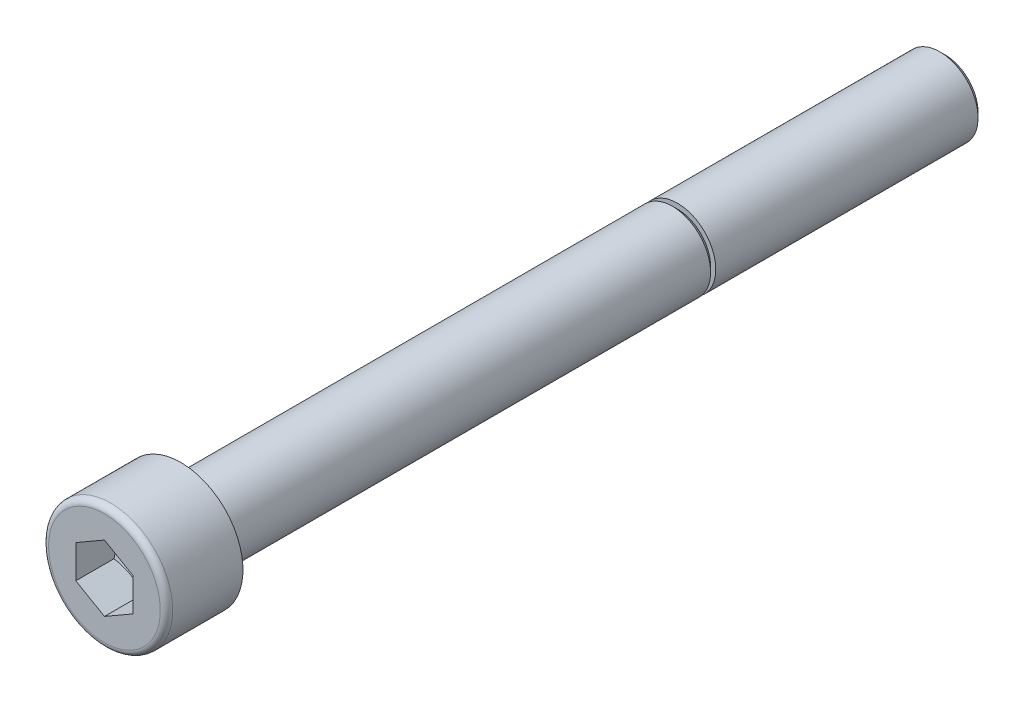
ISO-10303-21;
HEADER;
FILE_DESCRIPTION(('STEP AP214'),'2;1');
FILE_NAME('part.step','',(''),(''),'','','');
FILE_SCHEMA(('AUTOMOTIVE_DESIGN { 1 0 10303 214 1 1 1 1 }'));
ENDSEC;
DATA;
#1=APPLICATION_CONTEXT('core data for automotive mechanical design processes');
#2=APPLICATION_PROTOCOL_DEFINITION('international standard','automotive_design',2000,#1);
#3=PRODUCT_CONTEXT('',#1,'mechanical');
#4=PRODUCT('Part','Part','',(#3));
#5=PRODUCT_RELATED_PRODUCT_CATEGORY('part','',(#4));
#6=PRODUCT_DEFINITION_FORMATION('','',#4);
#7=PRODUCT_DEFINITION_CONTEXT('part definition',#1,'design');
#8=PRODUCT_DEFINITION('design','',#6,#7);
#9=PRODUCT_DEFINITION_SHAPE('','',#8);
#10=(LENGTH_UNIT() NAMED_UNIT(*) SI_UNIT(.MILLI.,.METRE.));
#11=(NAMED_UNIT(*) PLANE_ANGLE_UNIT() SI_UNIT($,.RADIAN.));
#12=(NAMED_UNIT(*) SI_UNIT($,.STERADIAN.) SOLID_ANGLE_UNIT());
#13=UNCERTAINTY_MEASURE_WITH_UNIT(LENGTH_MEASURE(1.E-05),#10,'distance_accuracy_value','');
#14=(GEOMETRIC_REPRESENTATION_CONTEXT(3) GLOBAL_UNCERTAINTY_ASSIGNED_CONTEXT((#13)) GLOBAL_UNIT_ASSIGNED_CONTEXT((#10,
#11,#12)) REPRESENTATION_CONTEXT('',''));
#15=CARTESIAN_POINT('',(0.,0.,0.));
#16=DIRECTION('',(0.,0.,1.));
#17=DIRECTION('',(1.,0.,0.));
#18=AXIS2_PLACEMENT_3D('',#15,#16,#17);
#19=CARTESIAN_POINT('',(-3.25,0.,0.));
#20=DIRECTION('',(0.,0.,-1.));
#21=DIRECTION('',(-1.,0.,0.));
#22=AXIS2_PLACEMENT_3D('',#19,#20,#21);
#23=PLANE('',#22);
#24=CARTESIAN_POINT('',(0.,0.,0.));
#25=DIRECTION('',(0.,0.,-1.));
#26=DIRECTION('',(-1.,0.,0.));
#27=AXIS2_PLACEMENT_3D('',#24,#25,#26);
#28=CIRCLE('',#27,6.5);
#29=CARTESIAN_POINT('',(-6.5,0.,0.));
#30=VERTEX_POINT('',#29);
#31=EDGE_CURVE('E12',#30,#30,#28,.T.);
#32=ORIENTED_EDGE('',*,*,#31,.T.);
#33=EDGE_LOOP('',(#32));
#34=FACE_BOUND('',#33,.T.);
#35=CARTESIAN_POINT('',(0.,0.,0.));
#36=DIRECTION('',(0.,0.,1.));
#37=DIRECTION('',(-1.,0.,0.));
#38=AXIS2_PLACEMENT_3D('',#35,#36,#37);
#39=CIRCLE('',#38,4.);
#40=CARTESIAN_POINT('',(4.,0.,0.));
#41=VERTEX_POINT('',#40);
#42=EDGE_CURVE('E152',#41,#41,#39,.T.);
#43=ORIENTED_EDGE('',*,*,#42,.T.);
#44=EDGE_LOOP('',(#43));
#45=FACE_BOUND('',#44,.T.);
#46=ADVANCED_FACE('F20',(#34,#45),#23,.T.);
#47=CARTESIAN_POINT('',(0.,0.,3.675));
#48=DIRECTION('',(0.,0.,1.));
#49=DIRECTION('',(-1.,0.,0.));
#50=AXIS2_PLACEMENT_3D('',#47,#48,#49);
#51=CYLINDRICAL_SURFACE('',#50,6.5);
#52=CARTESIAN_POINT('',(0.,0.,7.35));
#53=DIRECTION('',(0.,0.,-1.));
#54=DIRECTION('',(-1.,0.,0.));
#55=AXIS2_PLACEMENT_3D('',#52,#53,#54);
#56=CIRCLE('',#55,6.5);
#57=CARTESIAN_POINT('',(-6.5,0.,7.35));
#58=VERTEX_POINT('',#57);
#59=EDGE_CURVE('E24',#58,#58,#56,.T.);
#60=ORIENTED_EDGE('',*,*,#59,.T.);
#61=EDGE_LOOP('',(#60));
#62=FACE_BOUND('',#61,.T.);
#63=ORIENTED_EDGE('',*,*,#31,.F.);
#64=EDGE_LOOP('',(#63));
#65=FACE_BOUND('',#64,.T.);
#66=ADVANCED_FACE('F285',(#62,#65),#51,.T.);
#67=CARTESIAN_POINT('',(0.,0.,7.35));
#68=DIRECTION('',(0.,0.,-1.));
#69=DIRECTION('',(0.,-1.,0.));
#70=AXIS2_PLACEMENT_3D('',#67,#68,#69);
#71=TOROIDAL_SURFACE('',#70,5.85,0.65);
#72=CARTESIAN_POINT('',(0.,0.,8.));
#73=DIRECTION('',(0.,0.,-1.));
#74=DIRECTION('',(-1.,0.,0.));
#75=AXIS2_PLACEMENT_3D('',#72,#73,#74);
#76=CIRCLE('',#75,5.85);
#77=CARTESIAN_POINT('',(-5.85,0.,8.));
#78=VERTEX_POINT('',#77);
#79=EDGE_CURVE('E210',#78,#78,#76,.T.);
#80=ORIENTED_EDGE('',*,*,#79,.T.);
#81=EDGE_LOOP('',(#80));
#82=FACE_BOUND('',#81,.T.);
#83=ORIENTED_EDGE('',*,*,#59,.F.);
#84=EDGE_LOOP('',(#83));
#85=FACE_BOUND('',#84,.T.);
#86=ADVANCED_FACE('F22',(#82,#85),#71,.T.);
#87=CARTESIAN_POINT('',(-2.925,0.,8.));
#88=DIRECTION('',(0.,0.,1.));
#89=DIRECTION('',(1.,0.,0.));
#90=AXIS2_PLACEMENT_3D('',#87,#88,#89);
#91=PLANE('',#90);
#92=ORIENTED_EDGE('',*,*,#79,.F.);
#93=EDGE_LOOP('',(#92));
#94=FACE_BOUND('',#93,.T.);
#95=DIRECTION('',(-0.866025403784439,-0.5,0.));
#96=VECTOR('',#95,1.);
#97=CARTESIAN_POINT('',(0.403124300624837,-3.23135607651737,8.));
#98=LINE('',#97,#96);
#99=CARTESIAN_POINT('',(2.99999860124967,-1.73205,8.));
#100=VERTEX_POINT('',#99);
#101=CARTESIAN_POINT('',(0.,-3.4641,8.));
#102=VERTEX_POINT('',#101);
#103=EDGE_CURVE('E99',#100,#102,#98,.T.);
#104=ORIENTED_EDGE('',*,*,#103,.T.);
#105=DIRECTION('',(-0.866025403784439,0.5,0.));
#106=VECTOR('',#105,1.);
#107=CARTESIAN_POINT('',(-2.59687430062483,-1.96479392348263,8.));
#108=LINE('',#107,#106);
#109=CARTESIAN_POINT('',(-2.99999860124967,-1.73205,8.));
#110=VERTEX_POINT('',#109);
#111=EDGE_CURVE('E165',#102,#110,#108,.T.);
#112=ORIENTED_EDGE('',*,*,#111,.T.);
#113=DIRECTION('',(0.,1.,0.));
#114=VECTOR('',#113,1.);
#115=CARTESIAN_POINT('',(-2.99999860124967,0.,8.));
#116=LINE('',#115,#114);
#117=CARTESIAN_POINT('',(-2.99999860124967,1.73205,8.));
#118=VERTEX_POINT('',#117);
#119=EDGE_CURVE('E166',#110,#118,#116,.T.);
#120=ORIENTED_EDGE('',*,*,#119,.T.);
#121=DIRECTION('',(0.866025403784439,0.5,0.));
#122=VECTOR('',#121,1.);
#123=CARTESIAN_POINT('',(-2.59687430062483,1.96479392348263,8.));
#124=LINE('',#123,#122);
#125=CARTESIAN_POINT('',(0.,3.4641,8.));
#126=VERTEX_POINT('',#125);
#127=EDGE_CURVE('E155',#118,#126,#124,.T.);
#128=ORIENTED_EDGE('',*,*,#127,.T.);
#129=DIRECTION('',(0.866025403784439,-0.5,0.));
#130=VECTOR('',#129,1.);
#131=CARTESIAN_POINT('',(0.403124300624837,3.23135607651737,8.));
#132=LINE('',#131,#130);
#133=CARTESIAN_POINT('',(2.99999860124967,1.73205,8.));
#134=VERTEX_POINT('',#133);
#135=EDGE_CURVE('E196',#126,#134,#132,.T.);
#136=ORIENTED_EDGE('',*,*,#135,.T.);
#137=DIRECTION('',(0.,-1.,0.));
#138=VECTOR('',#137,1.);
#139=CARTESIAN_POINT('',(2.99999860124967,0.,8.));
#140=LINE('',#139,#138);
#141=EDGE_CURVE('E103',#134,#100,#140,.T.);
#142=ORIENTED_EDGE('',*,*,#141,.T.);
#143=EDGE_LOOP('',(#104,#112,#120,#128,#136,#142));
#144=FACE_BOUND('',#143,.T.);
#145=ADVANCED_FACE('F258',(#94,#144),#91,.T.);
#146=CARTESIAN_POINT('',(-1.729375,0.,-80.));
#147=DIRECTION('',(0.,0.,-1.));
#148=DIRECTION('',(-1.,0.,0.));
#149=AXIS2_PLACEMENT_3D('',#146,#147,#148);
#150=PLANE('',#149);
#151=CARTESIAN_POINT('',(0.,0.,-80.));
#152=DIRECTION('',(0.,0.,-1.));
#153=DIRECTION('',(-1.,0.,0.));
#154=AXIS2_PLACEMENT_3D('',#151,#152,#153);
#155=CIRCLE('',#154,3.45875);
#156=CARTESIAN_POINT('',(-3.45875,0.,-80.));
#157=VERTEX_POINT('',#156);
#158=EDGE_CURVE('E150',#157,#157,#155,.T.);
#159=ORIENTED_EDGE('',*,*,#158,.T.);
#160=EDGE_LOOP('',(#159));
#161=FACE_BOUND('',#160,.T.);
#162=ADVANCED_FACE('F280',(#161),#150,.T.);
#163=CARTESIAN_POINT('',(0.,0.,-79.729375));
#164=DIRECTION('',(0.,0.,1.));
#165=DIRECTION('',(-1.,0.,0.));
#166=AXIS2_PLACEMENT_3D('',#163,#164,#165);
#167=CONICAL_SURFACE('',#166,3.729375,0.785398163397443);
#168=CARTESIAN_POINT('',(0.,0.,-79.45875));
#169=DIRECTION('',(0.,0.,-1.));
#170=DIRECTION('',(-1.,0.,0.));
#171=AXIS2_PLACEMENT_3D('',#168,#169,#170);
#172=CIRCLE('',#171,4.);
#173=CARTESIAN_POINT('',(-4.,0.,-79.45875));
#174=VERTEX_POINT('',#173);
#175=EDGE_CURVE('E144',#174,#174,#172,.T.);
#176=ORIENTED_EDGE('',*,*,#175,.T.);
#177=EDGE_LOOP('',(#176));
#178=FACE_BOUND('',#177,.T.);
#179=ORIENTED_EDGE('',*,*,#158,.F.);
#180=EDGE_LOOP('',(#179));
#181=FACE_BOUND('',#180,.T.);
#182=ADVANCED_FACE('F266',(#178,#181),#167,.T.);
#183=CARTESIAN_POINT('',(0.,0.,-65.729375));
#184=DIRECTION('',(0.,0.,1.));
#185=DIRECTION('',(-1.,0.,0.));
#186=AXIS2_PLACEMENT_3D('',#183,#184,#185);
#187=CYLINDRICAL_SURFACE('',#186,4.);
#188=CARTESIAN_POINT('',(0.,0.,-52.));
#189=DIRECTION('',(0.,0.,-1.));
#190=DIRECTION('',(-1.,0.,0.));
#191=AXIS2_PLACEMENT_3D('',#188,#189,#190);
#192=CIRCLE('',#191,4.);
#193=CARTESIAN_POINT('',(-4.,0.,-52.));
#194=VERTEX_POINT('',#193);
#195=EDGE_CURVE('E151',#194,#194,#192,.T.);
#196=ORIENTED_EDGE('',*,*,#195,.T.);
#197=EDGE_LOOP('',(#196));
#198=FACE_BOUND('',#197,.T.);
#199=ORIENTED_EDGE('',*,*,#175,.F.);
#200=EDGE_LOOP('',(#199));
#201=FACE_BOUND('',#200,.T.);
#202=ADVANCED_FACE('F269',(#198,#201),#187,.T.);
#203=CARTESIAN_POINT('',(-3.729375,0.,-52.));
#204=DIRECTION('',(0.,0.,1.));
#205=DIRECTION('',(1.,0.,0.));
#206=AXIS2_PLACEMENT_3D('',#203,#204,#205);
#207=PLANE('',#206);
#208=CARTESIAN_POINT('',(0.,0.,-52.));
#209=DIRECTION('',(0.,0.,-1.));
#210=DIRECTION('',(-1.,0.,0.));
#211=AXIS2_PLACEMENT_3D('',#208,#209,#210);
#212=CIRCLE('',#211,3.45875);
#213=CARTESIAN_POINT('',(-3.45875,0.,-52.));
#214=VERTEX_POINT('',#213);
#215=EDGE_CURVE('E200',#214,#214,#212,.T.);
#216=ORIENTED_EDGE('',*,*,#215,.T.);
#217=EDGE_LOOP('',(#216));
#218=FACE_BOUND('',#217,.T.);
#219=ORIENTED_EDGE('',*,*,#195,.F.);
#220=EDGE_LOOP('',(#219));
#221=FACE_BOUND('',#220,.T.);
#222=ADVANCED_FACE('F271',(#218,#221),#207,.T.);
#223=CARTESIAN_POINT('',(0.,0.,-51.729375));
#224=DIRECTION('',(0.,0.,1.));
#225=DIRECTION('',(-1.,0.,0.));
#226=AXIS2_PLACEMENT_3D('',#223,#224,#225);
#227=CONICAL_SURFACE('',#226,3.729375,0.78539816339745);
#228=CARTESIAN_POINT('',(0.,0.,-51.45875));
#229=DIRECTION('',(0.,0.,-1.));
#230=DIRECTION('',(-1.,0.,0.));
#231=AXIS2_PLACEMENT_3D('',#228,#229,#230);
#232=CIRCLE('',#231,4.);
#233=CARTESIAN_POINT('',(-4.,0.,-51.45875));
#234=VERTEX_POINT('',#233);
#235=EDGE_CURVE('E131',#234,#234,#232,.T.);
#236=ORIENTED_EDGE('',*,*,#235,.T.);
#237=EDGE_LOOP('',(#236));
#238=FACE_BOUND('',#237,.T.);
#239=ORIENTED_EDGE('',*,*,#215,.F.);
#240=EDGE_LOOP('',(#239));
#241=FACE_BOUND('',#240,.T.);
#242=ADVANCED_FACE('F277',(#238,#241),#227,.T.);
#243=CARTESIAN_POINT('',(0.,0.,-25.229375));
#244=DIRECTION('',(0.,0.,1.));
#245=DIRECTION('',(-1.,0.,0.));
#246=AXIS2_PLACEMENT_3D('',#243,#244,#245);
#247=CYLINDRICAL_SURFACE('',#246,4.);
#248=ORIENTED_EDGE('',*,*,#42,.F.);
#249=EDGE_LOOP('',(#248));
#250=FACE_BOUND('',#249,.T.);
#251=ORIENTED_EDGE('',*,*,#235,.F.);
#252=EDGE_LOOP('',(#251));
#253=FACE_BOUND('',#252,.T.);
#254=ADVANCED_FACE('F303',(#250,#253),#247,.T.);
#255=CARTESIAN_POINT('',(-1.49999930062484,-2.598075,8.));
#256=DIRECTION('',(-0.5,-0.866025403784439,0.));
#257=DIRECTION('',(-0.866025403784439,0.5,0.));
#258=AXIS2_PLACEMENT_3D('',#255,#256,#257);
#259=PLANE('',#258);
#260=CARTESIAN_POINT('',(0.,-3.4641,4.));
#261=CARTESIAN_POINT('',(-1.49999930062483,-2.598075,3.50000023312505));
#262=CARTESIAN_POINT('',(-2.99999860124967,-1.73205,4.));
#263=(BOUNDED_CURVE() B_SPLINE_CURVE(2,(#260,#261,#262),.UNSPECIFIED.,.F.,
.F.) B_SPLINE_CURVE_WITH_KNOTS((3,3),(0.,3.50530677988333),
.UNSPECIFIED.) CURVE() GEOMETRIC_REPRESENTATION_ITEM() RATIONAL_B_SPLINE_CURVE((1.,
1.15470053837925,1.)) REPRESENTATION_ITEM(''));
#264=CARTESIAN_POINT('',(0.,-3.4641,4.));
#265=VERTEX_POINT('',#264);
#266=CARTESIAN_POINT('',(-2.99999860124967,-1.73205,4.));
#267=VERTEX_POINT('',#266);
#268=EDGE_CURVE('E120',#265,#267,#263,.T.);
#269=ORIENTED_EDGE('',*,*,#268,.T.);
#270=DIRECTION('',(0.,0.,-1.));
#271=VECTOR('',#270,1.);
#272=CARTESIAN_POINT('',(-2.99999860124967,-1.73205,8.));
#273=LINE('',#272,#271);
#274=EDGE_CURVE('E161',#110,#267,#273,.T.);
#275=ORIENTED_EDGE('',*,*,#274,.F.);
#276=ORIENTED_EDGE('',*,*,#111,.F.);
#277=DIRECTION('',(0.,0.,-1.));
#278=VECTOR('',#277,1.);
#279=CARTESIAN_POINT('',(0.,-3.4641,8.));
#280=LINE('',#279,#278);
#281=EDGE_CURVE('E134',#102,#265,#280,.T.);
#282=ORIENTED_EDGE('',*,*,#281,.T.);
#283=EDGE_LOOP('',(#269,#275,#276,#282));
#284=FACE_BOUND('',#283,.T.);
#285=ADVANCED_FACE('F300',(#284),#259,.F.);
#286=CARTESIAN_POINT('',(-2.99999860124967,0.,8.));
#287=DIRECTION('',(-1.,0.,0.));
#288=DIRECTION('',(0.,1.,0.));
#289=AXIS2_PLACEMENT_3D('',#286,#287,#288);
#290=PLANE('',#289);
#291=CARTESIAN_POINT('',(-2.99999860124967,-1.73205,4.));
#292=CARTESIAN_POINT('',(-2.99999860124967,0.,3.50000023312505));
#293=CARTESIAN_POINT('',(-2.99999860124967,1.73205,4.));
#294=(BOUNDED_CURVE() B_SPLINE_CURVE(2,(#291,#292,#293),.UNSPECIFIED.,.F.,
.F.) B_SPLINE_CURVE_WITH_KNOTS((3,3),(0.,3.50530677988333),
.UNSPECIFIED.) CURVE() GEOMETRIC_REPRESENTATION_ITEM() RATIONAL_B_SPLINE_CURVE((1.,
1.15470053837925,1.)) REPRESENTATION_ITEM(''));
#295=CARTESIAN_POINT('',(-2.99999860124967,1.73205,4.));
#296=VERTEX_POINT('',#295);
#297=EDGE_CURVE('E125',#267,#296,#294,.T.);
#298=ORIENTED_EDGE('',*,*,#297,.T.);
#299=DIRECTION('',(0.,0.,-1.));
#300=VECTOR('',#299,1.);
#301=CARTESIAN_POINT('',(-2.99999860124967,1.73205,8.));
#302=LINE('',#301,#300);
#303=EDGE_CURVE('E159',#118,#296,#302,.T.);
#304=ORIENTED_EDGE('',*,*,#303,.F.);
#305=ORIENTED_EDGE('',*,*,#119,.F.);
#306=ORIENTED_EDGE('',*,*,#274,.T.);
#307=EDGE_LOOP('',(#298,#304,#305,#306));
#308=FACE_BOUND('',#307,.T.);
#309=ADVANCED_FACE('F251',(#308),#290,.F.);
#310=CARTESIAN_POINT('',(-1.49999930062484,2.598075,8.));
#311=DIRECTION('',(-0.5,0.866025403784439,0.));
#312=DIRECTION('',(0.866025403784439,0.5,0.));
#313=AXIS2_PLACEMENT_3D('',#310,#311,#312);
#314=PLANE('',#313);
#315=CARTESIAN_POINT('',(-2.99999860124967,1.73205,4.));
#316=CARTESIAN_POINT('',(-1.49999930062484,2.598075,3.50000023312506));
#317=CARTESIAN_POINT('',(0.,3.4641,4.));
#318=(BOUNDED_CURVE() B_SPLINE_CURVE(2,(#315,#316,#317),.UNSPECIFIED.,.F.,
.F.) B_SPLINE_CURVE_WITH_KNOTS((3,3),(0.,3.50530677988333),
.UNSPECIFIED.) CURVE() GEOMETRIC_REPRESENTATION_ITEM() RATIONAL_B_SPLINE_CURVE((1.,
1.15470053837925,1.)) REPRESENTATION_ITEM(''));
#319=CARTESIAN_POINT('',(0.,3.4641,4.));
#320=VERTEX_POINT('',#319);
#321=EDGE_CURVE('E167',#296,#320,#318,.T.);
#322=ORIENTED_EDGE('',*,*,#321,.T.);
#323=DIRECTION('',(0.,0.,-1.));
#324=VECTOR('',#323,1.);
#325=CARTESIAN_POINT('',(0.,3.4641,8.));
#326=LINE('',#325,#324);
#327=EDGE_CURVE('E160',#126,#320,#326,.T.);
#328=ORIENTED_EDGE('',*,*,#327,.F.);
#329=ORIENTED_EDGE('',*,*,#127,.F.);
#330=ORIENTED_EDGE('',*,*,#303,.T.);
#331=EDGE_LOOP('',(#322,#328,#329,#330));
#332=FACE_BOUND('',#331,.T.);
#333=ADVANCED_FACE('F256',(#332),#314,.F.);
#334=CARTESIAN_POINT('',(1.49999930062484,2.598075,8.));
#335=DIRECTION('',(0.5,0.866025403784439,0.));
#336=DIRECTION('',(0.866025403784439,-0.5,0.));
#337=AXIS2_PLACEMENT_3D('',#334,#335,#336);
#338=PLANE('',#337);
#339=CARTESIAN_POINT('',(0.,3.4641,4.));
#340=CARTESIAN_POINT('',(1.49999930062484,2.598075,3.50000023312505));
#341=CARTESIAN_POINT('',(2.99999860124967,1.73205,4.));
#342=(BOUNDED_CURVE() B_SPLINE_CURVE(2,(#339,#340,#341),.UNSPECIFIED.,.F.,
.F.) B_SPLINE_CURVE_WITH_KNOTS((3,3),(0.,3.50530677988332),
.UNSPECIFIED.) CURVE() GEOMETRIC_REPRESENTATION_ITEM() RATIONAL_B_SPLINE_CURVE((1.,
1.15470053837925,1.)) REPRESENTATION_ITEM(''));
#343=CARTESIAN_POINT('',(2.99999860124967,1.73205,4.));
#344=VERTEX_POINT('',#343);
#345=EDGE_CURVE('E114',#320,#344,#342,.T.);
#346=ORIENTED_EDGE('',*,*,#345,.T.);
#347=DIRECTION('',(0.,0.,-1.));
#348=VECTOR('',#347,1.);
#349=CARTESIAN_POINT('',(2.99999860124967,1.73205,8.));
#350=LINE('',#349,#348);
#351=EDGE_CURVE('E109',#134,#344,#350,.T.);
#352=ORIENTED_EDGE('',*,*,#351,.F.);
#353=ORIENTED_EDGE('',*,*,#135,.F.);
#354=ORIENTED_EDGE('',*,*,#327,.T.);
#355=EDGE_LOOP('',(#346,#352,#353,#354));
#356=FACE_BOUND('',#355,.T.);
#357=ADVANCED_FACE('F294',(#356),#338,.F.);
#358=CARTESIAN_POINT('',(2.99999860124967,0.,8.));
#359=DIRECTION('',(1.,0.,0.));
#360=DIRECTION('',(0.,-1.,0.));
#361=AXIS2_PLACEMENT_3D('',#358,#359,#360);
#362=PLANE('',#361);
#363=CARTESIAN_POINT('',(2.99999860124967,1.73205,4.));
#364=CARTESIAN_POINT('',(2.99999860124969,0.,3.50000023312506));
#365=CARTESIAN_POINT('',(2.99999860124967,-1.73205,4.));
#366=(BOUNDED_CURVE() B_SPLINE_CURVE(2,(#363,#364,#365),.UNSPECIFIED.,.F.,
.F.) B_SPLINE_CURVE_WITH_KNOTS((3,3),(0.,3.50530677988333),
.UNSPECIFIED.) CURVE() GEOMETRIC_REPRESENTATION_ITEM() RATIONAL_B_SPLINE_CURVE((1.,
1.15470053837924,1.)) REPRESENTATION_ITEM(''));
#367=CARTESIAN_POINT('',(2.99999860124967,-1.73205,4.));
#368=VERTEX_POINT('',#367);
#369=EDGE_CURVE('E106',#344,#368,#366,.T.);
#370=ORIENTED_EDGE('',*,*,#369,.T.);
#371=DIRECTION('',(0.,0.,-1.));
#372=VECTOR('',#371,1.);
#373=CARTESIAN_POINT('',(2.99999860124967,-1.73205,8.));
#374=LINE('',#373,#372);
#375=EDGE_CURVE('E91',#100,#368,#374,.T.);
#376=ORIENTED_EDGE('',*,*,#375,.F.);
#377=ORIENTED_EDGE('',*,*,#141,.F.);
#378=ORIENTED_EDGE('',*,*,#351,.T.);
#379=EDGE_LOOP('',(#370,#376,#377,#378));
#380=FACE_BOUND('',#379,.T.);
#381=ADVANCED_FACE('F107',(#380),#362,.F.);
#382=CARTESIAN_POINT('',(1.49999930062484,-2.598075,8.));
#383=DIRECTION('',(0.5,-0.866025403784439,0.));
#384=DIRECTION('',(-0.866025403784439,-0.5,0.));
#385=AXIS2_PLACEMENT_3D('',#382,#383,#384);
#386=PLANE('',#385);
#387=CARTESIAN_POINT('',(2.99999860124967,-1.73205,4.));
#388=CARTESIAN_POINT('',(1.49999930062485,-2.598075,3.50000023312506));
#389=CARTESIAN_POINT('',(0.,-3.4641,4.));
#390=(BOUNDED_CURVE() B_SPLINE_CURVE(2,(#387,#388,#389),.UNSPECIFIED.,.F.,
.F.) B_SPLINE_CURVE_WITH_KNOTS((3,3),(0.,3.50530677988333),
.UNSPECIFIED.) CURVE() GEOMETRIC_REPRESENTATION_ITEM() RATIONAL_B_SPLINE_CURVE((1.,
1.15470053837924,1.)) REPRESENTATION_ITEM(''));
#391=EDGE_CURVE('E96',#368,#265,#390,.T.);
#392=ORIENTED_EDGE('',*,*,#391,.T.);
#393=ORIENTED_EDGE('',*,*,#281,.F.);
#394=ORIENTED_EDGE('',*,*,#103,.F.);
#395=ORIENTED_EDGE('',*,*,#375,.T.);
#396=EDGE_LOOP('',(#392,#393,#394,#395));
#397=FACE_BOUND('',#396,.T.);
#398=ADVANCED_FACE('F93',(#397),#386,.F.);
#399=CARTESIAN_POINT('',(0.,0.,3.00000046625011));
#400=DIRECTION('',(0.,0.,1.));
#401=DIRECTION('',(-1.,0.,0.));
#402=AXIS2_PLACEMENT_3D('',#399,#400,#401);
#403=CONICAL_SURFACE('',#402,1.73205,1.0471975511966);
#404=CARTESIAN_POINT('',(0.,0.,2.00000093250022));
#405=VERTEX_POINT('',#404);
#406=VERTEX_LOOP('',#405);
#407=FACE_BOUND('',#406,.T.);
#408=ORIENTED_EDGE('',*,*,#321,.F.);
#409=ORIENTED_EDGE('',*,*,#297,.F.);
#410=ORIENTED_EDGE('',*,*,#268,.F.);
#411=ORIENTED_EDGE('',*,*,#391,.F.);
#412=ORIENTED_EDGE('',*,*,#369,.F.);
#413=ORIENTED_EDGE('',*,*,#345,.F.);
#414=EDGE_LOOP('',(#408,#409,#410,#411,#412,#413));
#415=FACE_BOUND('',#414,.T.);
#416=ADVANCED_FACE('F117',(#407,#415),#403,.F.);
#417=CLOSED_SHELL('',(#46,#66,#86,#145,#162,#182,#202,#222,#242,#254,#285,#309,#333,#357,#381,
#398,#416));
#418=MANIFOLD_SOLID_BREP('B1',#417);
#419=ADVANCED_BREP_SHAPE_REPRESENTATION('',(#18,#418),#14);
#420=SHAPE_DEFINITION_REPRESENTATION(#9,#419);
ENDSEC;
END-ISO-10303-21;
